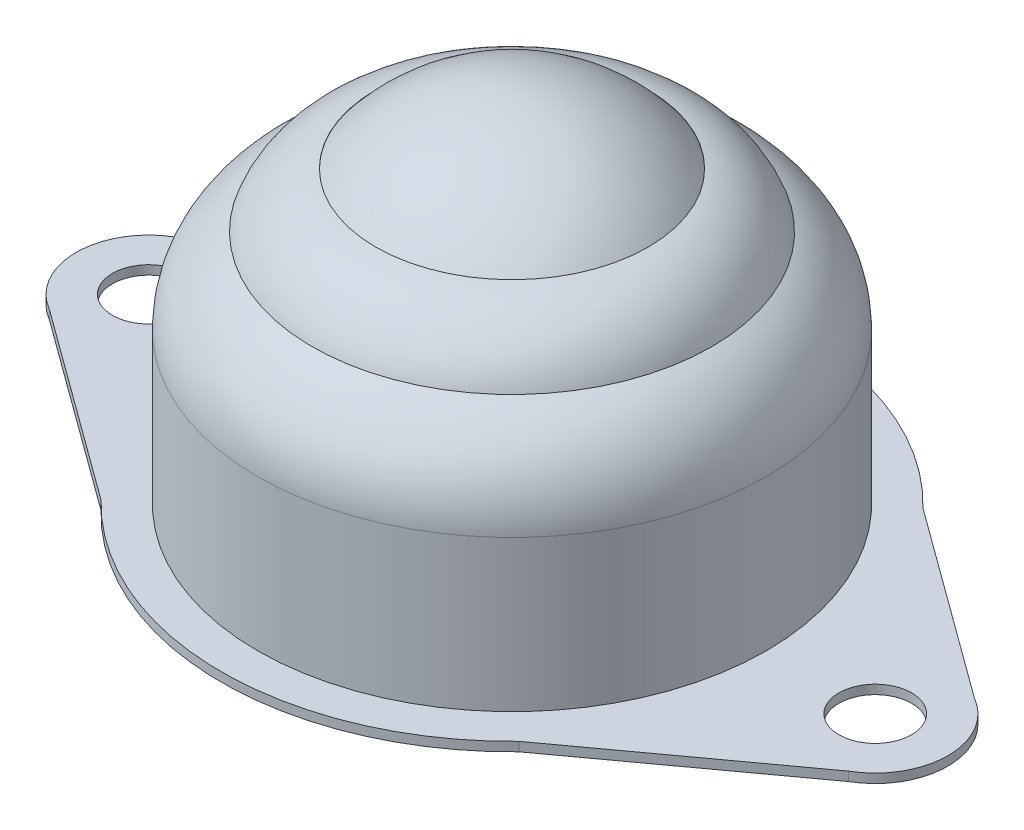
ISO-10303-21;
HEADER;
FILE_DESCRIPTION(('STEP AP214'),'2;1');
FILE_NAME('part.step','',(''),(''),'','','');
FILE_SCHEMA(('AUTOMOTIVE_DESIGN { 1 0 10303 214 1 1 1 1 }'));
ENDSEC;
DATA;
#1=APPLICATION_CONTEXT('core data for automotive mechanical design processes');
#2=APPLICATION_PROTOCOL_DEFINITION('international standard','automotive_design',2000,#1);
#3=PRODUCT_CONTEXT('',#1,'mechanical');
#4=PRODUCT('Part','Part','',(#3));
#5=PRODUCT_RELATED_PRODUCT_CATEGORY('part','',(#4));
#6=PRODUCT_DEFINITION_FORMATION('','',#4);
#7=PRODUCT_DEFINITION_CONTEXT('part definition',#1,'design');
#8=PRODUCT_DEFINITION('design','',#6,#7);
#9=PRODUCT_DEFINITION_SHAPE('','',#8);
#10=(LENGTH_UNIT() NAMED_UNIT(*) SI_UNIT(.MILLI.,.METRE.));
#11=(NAMED_UNIT(*) PLANE_ANGLE_UNIT() SI_UNIT($,.RADIAN.));
#12=(NAMED_UNIT(*) SI_UNIT($,.STERADIAN.) SOLID_ANGLE_UNIT());
#13=UNCERTAINTY_MEASURE_WITH_UNIT(LENGTH_MEASURE(1.E-05),#10,'distance_accuracy_value','');
#14=(GEOMETRIC_REPRESENTATION_CONTEXT(3) GLOBAL_UNCERTAINTY_ASSIGNED_CONTEXT((#13)) GLOBAL_UNIT_ASSIGNED_CONTEXT((#10,
#11,#12)) REPRESENTATION_CONTEXT('',''));
#15=CARTESIAN_POINT('',(0.,0.,0.));
#16=DIRECTION('',(0.,0.,1.));
#17=DIRECTION('',(1.,0.,0.));
#18=AXIS2_PLACEMENT_3D('',#15,#16,#17);
#19=CARTESIAN_POINT('',(0.,9.75,0.));
#20=DIRECTION('',(0.,1.,0.));
#21=DIRECTION('',(1.,0.,0.));
#22=AXIS2_PLACEMENT_3D('',#19,#20,#21);
#23=SPHERICAL_SURFACE('',#22,9.75);
#24=CARTESIAN_POINT('',(0.,19.5,0.));
#25=VERTEX_POINT('',#24);
#26=VERTEX_LOOP('',#25);
#27=FACE_BOUND('',#26,.T.);
#28=ADVANCED_FACE('F42',(#27),#23,.T.);
#29=CLOSED_SHELL('',(#28));
#30=MANIFOLD_SOLID_BREP('B2',#29);
#31=CARTESIAN_POINT('',(0.,8.30667544842264,0.));
#32=DIRECTION('',(0.,-1.,0.));
#33=DIRECTION('',(1.,0.,0.));
#34=AXIS2_PLACEMENT_3D('',#31,#32,#33);
#35=TOROIDAL_SURFACE('',#34,8.82878410892679,5.17121589107318);
#36=CARTESIAN_POINT('',(0.,8.30667544842267,0.));
#37=DIRECTION('',(0.,-1.,0.));
#38=DIRECTION('',(1.,0.,0.));
#39=AXIS2_PLACEMENT_3D('',#36,#37,#38);
#40=CIRCLE('',#39,14.);
#41=CARTESIAN_POINT('',(13.9999999999999,8.30667544842272,0.));
#42=VERTEX_POINT('',#41);
#43=EDGE_CURVE('E182',#42,#42,#40,.T.);
#44=ORIENTED_EDGE('',*,*,#43,.F.);
#45=EDGE_LOOP('',(#44));
#46=FACE_BOUND('',#45,.T.);
#47=CARTESIAN_POINT('',(0.,13.,0.));
#48=DIRECTION('',(0.,-1.,0.));
#49=DIRECTION('',(1.,0.,0.));
#50=AXIS2_PLACEMENT_3D('',#47,#48,#49);
#51=CIRCLE('',#50,10.9999999999999);
#52=CARTESIAN_POINT('',(10.9999999999999,13.0000000000001,0.));
#53=VERTEX_POINT('',#52);
#54=EDGE_CURVE('E40',#53,#53,#51,.T.);
#55=ORIENTED_EDGE('',*,*,#54,.T.);
#56=EDGE_LOOP('',(#55));
#57=FACE_BOUND('',#56,.T.);
#58=ADVANCED_FACE('F54',(#46,#57),#35,.T.);
#59=CARTESIAN_POINT('',(0.,11.5038055215238,0.));
#60=DIRECTION('',(0.,-1.,0.));
#61=DIRECTION('',(1.,0.,0.));
#62=AXIS2_PLACEMENT_3D('',#59,#60,#61);
#63=TOROIDAL_SURFACE('',#62,6.68183330416316,4.57002861374594);
#64=ORIENTED_EDGE('',*,*,#54,.F.);
#65=EDGE_LOOP('',(#64));
#66=FACE_BOUND('',#65,.T.);
#67=CARTESIAN_POINT('',(0.,16.,0.));
#68=DIRECTION('',(0.,-1.,0.));
#69=DIRECTION('',(1.,0.,0.));
#70=AXIS2_PLACEMENT_3D('',#67,#68,#69);
#71=CIRCLE('',#70,7.4999999999999);
#72=CARTESIAN_POINT('',(7.49999999999984,16.,0.));
#73=VERTEX_POINT('',#72);
#74=EDGE_CURVE('E62',#73,#73,#71,.T.);
#75=ORIENTED_EDGE('',*,*,#74,.T.);
#76=EDGE_LOOP('',(#75));
#77=FACE_BOUND('',#76,.T.);
#78=ADVANCED_FACE('F202',(#66,#77),#63,.T.);
#79=CARTESIAN_POINT('',(0.,15.8032312329533,0.));
#80=DIRECTION('',(0.,1.,0.));
#81=DIRECTION('',(-1.,0.,0.));
#82=AXIS2_PLACEMENT_3D('',#79,#80,#81);
#83=CONICAL_SURFACE('',#82,7.46419424187507,0.179999204343552);
#84=ORIENTED_EDGE('',*,*,#74,.F.);
#85=EDGE_LOOP('',(#84));
#86=FACE_BOUND('',#85,.T.);
#87=CARTESIAN_POINT('',(0.,15.8032312329533,0.));
#88=DIRECTION('',(0.,-1.,0.));
#89=DIRECTION('',(1.,0.,0.));
#90=AXIS2_PLACEMENT_3D('',#87,#88,#89);
#91=CIRCLE('',#90,7.46419424187507);
#92=CARTESIAN_POINT('',(7.46419424187501,15.8032312329533,0.));
#93=VERTEX_POINT('',#92);
#94=EDGE_CURVE('E197',#93,#93,#91,.T.);
#95=ORIENTED_EDGE('',*,*,#94,.T.);
#96=EDGE_LOOP('',(#95));
#97=FACE_BOUND('',#96,.T.);
#98=ADVANCED_FACE('F204',(#86,#97),#83,.F.);
#99=CARTESIAN_POINT('',(0.,11.5038055215238,0.));
#100=DIRECTION('',(0.,-1.,0.));
#101=DIRECTION('',(1.,0.,0.));
#102=AXIS2_PLACEMENT_3D('',#99,#100,#101);
#103=TOROIDAL_SURFACE('',#102,6.68183330416316,4.37002861374594);
#104=ORIENTED_EDGE('',*,*,#94,.F.);
#105=EDGE_LOOP('',(#104));
#106=FACE_BOUND('',#105,.T.);
#107=CARTESIAN_POINT('',(0.,12.8537025769554,0.));
#108=DIRECTION('',(0.,-1.,0.));
#109=DIRECTION('',(1.,0.,0.));
#110=AXIS2_PLACEMENT_3D('',#107,#108,#109);
#111=CIRCLE('',#110,10.8381451337418);
#112=CARTESIAN_POINT('',(10.8381451337417,12.8537025769554,0.));
#113=VERTEX_POINT('',#112);
#114=EDGE_CURVE('E194',#113,#113,#111,.T.);
#115=ORIENTED_EDGE('',*,*,#114,.T.);
#116=EDGE_LOOP('',(#115));
#117=FACE_BOUND('',#116,.T.);
#118=ADVANCED_FACE('F207',(#106,#117),#103,.F.);
#119=CARTESIAN_POINT('',(0.,8.30667544842264,0.));
#120=DIRECTION('',(0.,-1.,0.));
#121=DIRECTION('',(1.,0.,0.));
#122=AXIS2_PLACEMENT_3D('',#119,#120,#121);
#123=TOROIDAL_SURFACE('',#122,8.82878410892679,4.97121589107318);
#124=ORIENTED_EDGE('',*,*,#114,.F.);
#125=EDGE_LOOP('',(#124));
#126=FACE_BOUND('',#125,.T.);
#127=CARTESIAN_POINT('',(0.,8.30667544842267,0.));
#128=DIRECTION('',(0.,-1.,0.));
#129=DIRECTION('',(1.,0.,0.));
#130=AXIS2_PLACEMENT_3D('',#127,#128,#129);
#131=CIRCLE('',#130,13.8);
#132=CARTESIAN_POINT('',(13.7999999999999,8.30667544842272,0.));
#133=VERTEX_POINT('',#132);
#134=EDGE_CURVE('E191',#133,#133,#131,.T.);
#135=ORIENTED_EDGE('',*,*,#134,.T.);
#136=EDGE_LOOP('',(#135));
#137=FACE_BOUND('',#136,.T.);
#138=ADVANCED_FACE('F213',(#126,#137),#123,.F.);
#139=CARTESIAN_POINT('',(5.42695743456729E-13,-155.434238590703,0.));
#140=DIRECTION('',(0.,-1.,0.));
#141=DIRECTION('',(1.,0.,0.));
#142=AXIS2_PLACEMENT_3D('',#139,#140,#141);
#143=CYLINDRICAL_SURFACE('',#142,13.8);
#144=ORIENTED_EDGE('',*,*,#134,.F.);
#145=EDGE_LOOP('',(#144));
#146=FACE_BOUND('',#145,.T.);
#147=CARTESIAN_POINT('',(0.,0.200000000000061,0.));
#148=DIRECTION('',(0.,-1.,0.));
#149=DIRECTION('',(1.,0.,0.));
#150=AXIS2_PLACEMENT_3D('',#147,#148,#149);
#151=CIRCLE('',#150,13.8);
#152=CARTESIAN_POINT('',(13.8,0.200000000000109,0.));
#153=VERTEX_POINT('',#152);
#154=EDGE_CURVE('E188',#153,#153,#151,.T.);
#155=ORIENTED_EDGE('',*,*,#154,.T.);
#156=EDGE_LOOP('',(#155));
#157=FACE_BOUND('',#156,.T.);
#158=ADVANCED_FACE('F219',(#146,#157),#143,.F.);
#159=CARTESIAN_POINT('',(-13.8,0.199999999999976,0.));
#160=DIRECTION('',(0.,-1.,0.));
#161=DIRECTION('',(1.,0.,0.));
#162=AXIS2_PLACEMENT_3D('',#159,#160,#161);
#163=PLANE('',#162);
#164=ORIENTED_EDGE('',*,*,#154,.F.);
#165=EDGE_LOOP('',(#164));
#166=FACE_BOUND('',#165,.T.);
#167=ADVANCED_FACE('F225',(#166),#163,.F.);
#168=CARTESIAN_POINT('',(5.42695743456729E-13,-155.434238590703,0.));
#169=DIRECTION('',(0.,-1.,0.));
#170=DIRECTION('',(1.,0.,0.));
#171=AXIS2_PLACEMENT_3D('',#168,#169,#170);
#172=CYLINDRICAL_SURFACE('',#171,14.);
#173=CARTESIAN_POINT('',(0.,0.,0.));
#174=DIRECTION('',(0.,-1.,0.));
#175=DIRECTION('',(1.,0.,0.));
#176=AXIS2_PLACEMENT_3D('',#173,#174,#175);
#177=CIRCLE('',#176,14.);
#178=CARTESIAN_POINT('',(14.,1.04391889975062E-13,0.));
#179=VERTEX_POINT('',#178);
#180=EDGE_CURVE('E185',#179,#179,#177,.T.);
#181=ORIENTED_EDGE('',*,*,#180,.F.);
#182=EDGE_LOOP('',(#181));
#183=FACE_BOUND('',#182,.T.);
#184=ORIENTED_EDGE('',*,*,#43,.T.);
#185=EDGE_LOOP('',(#184));
#186=FACE_BOUND('',#185,.T.);
#187=ADVANCED_FACE('F230',(#183,#186),#172,.T.);
#188=CARTESIAN_POINT('',(0.,-0.5,0.));
#189=DIRECTION('',(0.,-1.,0.));
#190=DIRECTION('',(1.,0.,0.));
#191=AXIS2_PLACEMENT_3D('',#188,#189,#190);
#192=PLANE('',#191);
#193=CARTESIAN_POINT('',(-20.,-0.50000000000007,0.));
#194=DIRECTION('',(0.,-1.,0.));
#195=DIRECTION('',(-1.,0.,0.));
#196=AXIS2_PLACEMENT_3D('',#193,#194,#195);
#197=CIRCLE('',#196,2.);
#198=CARTESIAN_POINT('',(-22.,-0.500000000000077,0.));
#199=VERTEX_POINT('',#198);
#200=EDGE_CURVE('E156',#199,#199,#197,.T.);
#201=ORIENTED_EDGE('',*,*,#200,.F.);
#202=EDGE_LOOP('',(#201));
#203=FACE_BOUND('',#202,.T.);
#204=CARTESIAN_POINT('',(0.,-0.5,0.));
#205=DIRECTION('',(0.,-1.,0.));
#206=DIRECTION('',(1.,0.,0.));
#207=AXIS2_PLACEMENT_3D('',#204,#205,#206);
#208=CIRCLE('',#207,16.);
#209=CARTESIAN_POINT('',(11.4999999999999,-0.49999999999996,11.1242977306435));
#210=VERTEX_POINT('',#209);
#211=CARTESIAN_POINT('',(-11.5,-0.50000000000004,11.1242977306435));
#212=VERTEX_POINT('',#211);
#213=EDGE_CURVE('E167',#210,#212,#208,.T.);
#214=ORIENTED_EDGE('',*,*,#213,.T.);
#215=DIRECTION('',(-0.807862969973212,0.,-0.589370360423784));
#216=VECTOR('',#215,1.);
#217=CARTESIAN_POINT('',(-22.,-0.500000000000077,3.46410161513776));
#218=LINE('',#217,#216);
#219=CARTESIAN_POINT('',(-22.,-0.500000000000077,3.46410161513776));
#220=VERTEX_POINT('',#219);
#221=EDGE_CURVE('E114',#212,#220,#218,.T.);
#222=ORIENTED_EDGE('',*,*,#221,.T.);
#223=CARTESIAN_POINT('',(-20.,-0.50000000000007,0.));
#224=DIRECTION('',(0.,-1.,0.));
#225=DIRECTION('',(-1.,0.,0.));
#226=AXIS2_PLACEMENT_3D('',#223,#224,#225);
#227=CIRCLE('',#226,4.);
#228=CARTESIAN_POINT('',(-22.,-0.500000000000077,-3.46410161513776));
#229=VERTEX_POINT('',#228);
#230=EDGE_CURVE('E410',#220,#229,#227,.T.);
#231=ORIENTED_EDGE('',*,*,#230,.T.);
#232=DIRECTION('',(0.807862969973212,0.,-0.589370360423784));
#233=VECTOR('',#232,1.);
#234=CARTESIAN_POINT('',(-11.5,-0.50000000000004,-11.1242977306435));
#235=LINE('',#234,#233);
#236=CARTESIAN_POINT('',(-11.5,-0.50000000000004,-11.1242977306435));
#237=VERTEX_POINT('',#236);
#238=EDGE_CURVE('E412',#229,#237,#235,.T.);
#239=ORIENTED_EDGE('',*,*,#238,.T.);
#240=CARTESIAN_POINT('',(0.,-0.5,0.));
#241=DIRECTION('',(0.,-1.,0.));
#242=DIRECTION('',(1.,0.,0.));
#243=AXIS2_PLACEMENT_3D('',#240,#241,#242);
#244=CIRCLE('',#243,16.);
#245=CARTESIAN_POINT('',(11.5000000000001,-0.49999999999996,-11.1242977306435));
#246=VERTEX_POINT('',#245);
#247=EDGE_CURVE('E134',#237,#246,#244,.T.);
#248=ORIENTED_EDGE('',*,*,#247,.T.);
#249=DIRECTION('',(0.807862969973203,0.,0.589370360423797));
#250=VECTOR('',#249,1.);
#251=CARTESIAN_POINT('',(11.5000000000001,-0.49999999999996,-11.1242977306435));
#252=LINE('',#251,#250);
#253=CARTESIAN_POINT('',(22.,-0.499999999999923,-3.46410161513753));
#254=VERTEX_POINT('',#253);
#255=EDGE_CURVE('E127',#246,#254,#252,.T.);
#256=ORIENTED_EDGE('',*,*,#255,.T.);
#257=CARTESIAN_POINT('',(20.,-0.49999999999993,0.));
#258=DIRECTION('',(0.,-1.,0.));
#259=DIRECTION('',(1.,0.,0.));
#260=AXIS2_PLACEMENT_3D('',#257,#258,#259);
#261=CIRCLE('',#260,3.9999999999999);
#262=CARTESIAN_POINT('',(21.9999999999999,-0.499999999999923,3.46410161513768));
#263=VERTEX_POINT('',#262);
#264=EDGE_CURVE('E132',#254,#263,#261,.T.);
#265=ORIENTED_EDGE('',*,*,#264,.T.);
#266=DIRECTION('',(-0.807862969973213,0.,0.589370360423782));
#267=VECTOR('',#266,1.);
#268=CARTESIAN_POINT('',(22.,-0.499999999999923,3.46410161513776));
#269=LINE('',#268,#267);
#270=EDGE_CURVE('E70',#263,#210,#269,.T.);
#271=ORIENTED_EDGE('',*,*,#270,.T.);
#272=EDGE_LOOP('',(#214,#222,#231,#239,#248,#256,#265,#271));
#273=FACE_BOUND('',#272,.T.);
#274=CARTESIAN_POINT('',(20.,-0.49999999999993,0.));
#275=DIRECTION('',(0.,-1.,0.));
#276=DIRECTION('',(1.,0.,0.));
#277=AXIS2_PLACEMENT_3D('',#274,#275,#276);
#278=CIRCLE('',#277,2.00000000000001);
#279=CARTESIAN_POINT('',(22.,-0.499999999999923,0.));
#280=VERTEX_POINT('',#279);
#281=EDGE_CURVE('E395',#280,#280,#278,.T.);
#282=ORIENTED_EDGE('',*,*,#281,.F.);
#283=EDGE_LOOP('',(#282));
#284=FACE_BOUND('',#283,.T.);
#285=ADVANCED_FACE('F129',(#203,#273,#284),#192,.T.);
#286=CARTESIAN_POINT('',(0.,0.,0.));
#287=DIRECTION('',(0.,-1.,0.));
#288=DIRECTION('',(1.,0.,0.));
#289=AXIS2_PLACEMENT_3D('',#286,#287,#288);
#290=PLANE('',#289);
#291=ORIENTED_EDGE('',*,*,#180,.T.);
#292=EDGE_LOOP('',(#291));
#293=FACE_BOUND('',#292,.T.);
#294=CARTESIAN_POINT('',(0.,0.,0.));
#295=DIRECTION('',(0.,-1.,0.));
#296=DIRECTION('',(1.,0.,0.));
#297=AXIS2_PLACEMENT_3D('',#294,#295,#296);
#298=CIRCLE('',#297,16.);
#299=CARTESIAN_POINT('',(11.4999999999999,0.,11.1242977306435));
#300=VERTEX_POINT('',#299);
#301=CARTESIAN_POINT('',(-11.5,0.,11.1242977306435));
#302=VERTEX_POINT('',#301);
#303=EDGE_CURVE('E152',#300,#302,#298,.T.);
#304=ORIENTED_EDGE('',*,*,#303,.F.);
#305=DIRECTION('',(-0.807862969973213,0.,0.589370360423782));
#306=VECTOR('',#305,1.);
#307=CARTESIAN_POINT('',(22.,0.,3.46410161513776));
#308=LINE('',#307,#306);
#309=CARTESIAN_POINT('',(21.9999999999999,0.,3.46410161513768));
#310=VERTEX_POINT('',#309);
#311=EDGE_CURVE('E105',#310,#300,#308,.T.);
#312=ORIENTED_EDGE('',*,*,#311,.F.);
#313=CARTESIAN_POINT('',(20.,0.,0.));
#314=DIRECTION('',(0.,-1.,0.));
#315=DIRECTION('',(1.,0.,0.));
#316=AXIS2_PLACEMENT_3D('',#313,#314,#315);
#317=CIRCLE('',#316,3.9999999999999);
#318=CARTESIAN_POINT('',(22.,0.,-3.46410161513753));
#319=VERTEX_POINT('',#318);
#320=EDGE_CURVE('E99',#319,#310,#317,.T.);
#321=ORIENTED_EDGE('',*,*,#320,.F.);
#322=DIRECTION('',(0.807862969973203,0.,0.589370360423797));
#323=VECTOR('',#322,1.);
#324=CARTESIAN_POINT('',(11.5000000000001,0.,-11.1242977306435));
#325=LINE('',#324,#323);
#326=CARTESIAN_POINT('',(11.5000000000001,0.,-11.1242977306435));
#327=VERTEX_POINT('',#326);
#328=EDGE_CURVE('E142',#327,#319,#325,.T.);
#329=ORIENTED_EDGE('',*,*,#328,.F.);
#330=CARTESIAN_POINT('',(0.,0.,0.));
#331=DIRECTION('',(0.,-1.,0.));
#332=DIRECTION('',(1.,0.,0.));
#333=AXIS2_PLACEMENT_3D('',#330,#331,#332);
#334=CIRCLE('',#333,16.);
#335=CARTESIAN_POINT('',(-11.5,0.,-11.1242977306435));
#336=VERTEX_POINT('',#335);
#337=EDGE_CURVE('E162',#336,#327,#334,.T.);
#338=ORIENTED_EDGE('',*,*,#337,.F.);
#339=DIRECTION('',(0.807862969973212,0.,-0.589370360423784));
#340=VECTOR('',#339,1.);
#341=CARTESIAN_POINT('',(-11.5,0.,-11.1242977306435));
#342=LINE('',#341,#340);
#343=CARTESIAN_POINT('',(-22.,0.,-3.46410161513776));
#344=VERTEX_POINT('',#343);
#345=EDGE_CURVE('E160',#344,#336,#342,.T.);
#346=ORIENTED_EDGE('',*,*,#345,.F.);
#347=CARTESIAN_POINT('',(-20.,0.,0.));
#348=DIRECTION('',(0.,-1.,0.));
#349=DIRECTION('',(-1.,0.,0.));
#350=AXIS2_PLACEMENT_3D('',#347,#348,#349);
#351=CIRCLE('',#350,4.);
#352=CARTESIAN_POINT('',(-22.,0.,3.46410161513776));
#353=VERTEX_POINT('',#352);
#354=EDGE_CURVE('E158',#353,#344,#351,.T.);
#355=ORIENTED_EDGE('',*,*,#354,.F.);
#356=DIRECTION('',(-0.807862969973212,0.,-0.589370360423784));
#357=VECTOR('',#356,1.);
#358=CARTESIAN_POINT('',(-22.,0.,3.46410161513776));
#359=LINE('',#358,#357);
#360=EDGE_CURVE('E155',#302,#353,#359,.T.);
#361=ORIENTED_EDGE('',*,*,#360,.F.);
#362=EDGE_LOOP('',(#304,#312,#321,#329,#338,#346,#355,#361));
#363=FACE_BOUND('',#362,.T.);
#364=CARTESIAN_POINT('',(-20.,0.,0.));
#365=DIRECTION('',(0.,-1.,0.));
#366=DIRECTION('',(-1.,0.,0.));
#367=AXIS2_PLACEMENT_3D('',#364,#365,#366);
#368=CIRCLE('',#367,2.);
#369=CARTESIAN_POINT('',(-22.,0.,0.));
#370=VERTEX_POINT('',#369);
#371=EDGE_CURVE('E401',#370,#370,#368,.T.);
#372=ORIENTED_EDGE('',*,*,#371,.T.);
#373=EDGE_LOOP('',(#372));
#374=FACE_BOUND('',#373,.T.);
#375=CARTESIAN_POINT('',(20.,0.,0.));
#376=DIRECTION('',(0.,-1.,0.));
#377=DIRECTION('',(1.,0.,0.));
#378=AXIS2_PLACEMENT_3D('',#375,#376,#377);
#379=CIRCLE('',#378,2.00000000000001);
#380=CARTESIAN_POINT('',(22.,0.,0.));
#381=VERTEX_POINT('',#380);
#382=EDGE_CURVE('E398',#381,#381,#379,.T.);
#383=ORIENTED_EDGE('',*,*,#382,.T.);
#384=EDGE_LOOP('',(#383));
#385=FACE_BOUND('',#384,.T.);
#386=ADVANCED_FACE('F284',(#293,#363,#374,#385),#290,.F.);
#387=CARTESIAN_POINT('',(0.,-0.5,0.));
#388=DIRECTION('',(0.,1.,0.));
#389=DIRECTION('',(-1.,0.,0.));
#390=AXIS2_PLACEMENT_3D('',#387,#388,#389);
#391=CYLINDRICAL_SURFACE('',#390,16.);
#392=ORIENTED_EDGE('',*,*,#303,.T.);
#393=DIRECTION('',(0.,1.,0.));
#394=VECTOR('',#393,1.);
#395=CARTESIAN_POINT('',(-11.5,-0.50000000000004,11.1242977306435));
#396=LINE('',#395,#394);
#397=EDGE_CURVE('E180',#212,#302,#396,.T.);
#398=ORIENTED_EDGE('',*,*,#397,.F.);
#399=ORIENTED_EDGE('',*,*,#213,.F.);
#400=DIRECTION('',(0.,1.,0.));
#401=VECTOR('',#400,1.);
#402=CARTESIAN_POINT('',(11.4999999999999,-0.49999999999996,11.1242977306435));
#403=LINE('',#402,#401);
#404=EDGE_CURVE('E148',#210,#300,#403,.T.);
#405=ORIENTED_EDGE('',*,*,#404,.T.);
#406=EDGE_LOOP('',(#392,#398,#399,#405));
#407=FACE_BOUND('',#406,.T.);
#408=ADVANCED_FACE('F294',(#407),#391,.T.);
#409=CARTESIAN_POINT('',(-22.,-0.500000000000077,3.46410161513776));
#410=DIRECTION('',(0.589370360423784,0.,-0.807862969973212));
#411=DIRECTION('',(-0.807862969973212,0.,-0.589370360423784));
#412=AXIS2_PLACEMENT_3D('',#409,#410,#411);
#413=PLANE('',#412);
#414=ORIENTED_EDGE('',*,*,#360,.T.);
#415=DIRECTION('',(0.,1.,0.));
#416=VECTOR('',#415,1.);
#417=CARTESIAN_POINT('',(-22.,-0.500000000000077,3.46410161513776));
#418=LINE('',#417,#416);
#419=EDGE_CURVE('E177',#220,#353,#418,.T.);
#420=ORIENTED_EDGE('',*,*,#419,.F.);
#421=ORIENTED_EDGE('',*,*,#221,.F.);
#422=ORIENTED_EDGE('',*,*,#397,.T.);
#423=EDGE_LOOP('',(#414,#420,#421,#422));
#424=FACE_BOUND('',#423,.T.);
#425=ADVANCED_FACE('F304',(#424),#413,.F.);
#426=CARTESIAN_POINT('',(-20.,-0.50000000000007,0.));
#427=DIRECTION('',(0.,1.,0.));
#428=DIRECTION('',(-1.,0.,0.));
#429=AXIS2_PLACEMENT_3D('',#426,#427,#428);
#430=CYLINDRICAL_SURFACE('',#429,4.);
#431=ORIENTED_EDGE('',*,*,#354,.T.);
#432=DIRECTION('',(0.,1.,0.));
#433=VECTOR('',#432,1.);
#434=CARTESIAN_POINT('',(-22.,-0.500000000000077,-3.46410161513776));
#435=LINE('',#434,#433);
#436=EDGE_CURVE('E174',#229,#344,#435,.T.);
#437=ORIENTED_EDGE('',*,*,#436,.F.);
#438=ORIENTED_EDGE('',*,*,#230,.F.);
#439=ORIENTED_EDGE('',*,*,#419,.T.);
#440=EDGE_LOOP('',(#431,#437,#438,#439));
#441=FACE_BOUND('',#440,.T.);
#442=ADVANCED_FACE('F314',(#441),#430,.T.);
#443=CARTESIAN_POINT('',(-11.5,-0.50000000000004,-11.1242977306435));
#444=DIRECTION('',(0.589370360423784,0.,0.807862969973212));
#445=DIRECTION('',(0.807862969973212,0.,-0.589370360423784));
#446=AXIS2_PLACEMENT_3D('',#443,#444,#445);
#447=PLANE('',#446);
#448=ORIENTED_EDGE('',*,*,#345,.T.);
#449=DIRECTION('',(0.,1.,0.));
#450=VECTOR('',#449,1.);
#451=CARTESIAN_POINT('',(-11.5,-0.50000000000004,-11.1242977306435));
#452=LINE('',#451,#450);
#453=EDGE_CURVE('E171',#237,#336,#452,.T.);
#454=ORIENTED_EDGE('',*,*,#453,.F.);
#455=ORIENTED_EDGE('',*,*,#238,.F.);
#456=ORIENTED_EDGE('',*,*,#436,.T.);
#457=EDGE_LOOP('',(#448,#454,#455,#456));
#458=FACE_BOUND('',#457,.T.);
#459=ADVANCED_FACE('F323',(#458),#447,.F.);
#460=CARTESIAN_POINT('',(0.,-0.5,0.));
#461=DIRECTION('',(0.,1.,0.));
#462=DIRECTION('',(-1.,0.,0.));
#463=AXIS2_PLACEMENT_3D('',#460,#461,#462);
#464=CYLINDRICAL_SURFACE('',#463,16.);
#465=ORIENTED_EDGE('',*,*,#337,.T.);
#466=DIRECTION('',(0.,1.,0.));
#467=VECTOR('',#466,1.);
#468=CARTESIAN_POINT('',(11.5000000000001,-0.49999999999996,-11.1242977306435));
#469=LINE('',#468,#467);
#470=EDGE_CURVE('E143',#246,#327,#469,.T.);
#471=ORIENTED_EDGE('',*,*,#470,.F.);
#472=ORIENTED_EDGE('',*,*,#247,.F.);
#473=ORIENTED_EDGE('',*,*,#453,.T.);
#474=EDGE_LOOP('',(#465,#471,#472,#473));
#475=FACE_BOUND('',#474,.T.);
#476=ADVANCED_FACE('F333',(#475),#464,.T.);
#477=CARTESIAN_POINT('',(11.5000000000001,-0.49999999999996,-11.1242977306435));
#478=DIRECTION('',(-0.589370360423797,0.,0.807862969973203));
#479=DIRECTION('',(0.807862969973202,0.,0.589370360423797));
#480=AXIS2_PLACEMENT_3D('',#477,#478,#479);
#481=PLANE('',#480);
#482=ORIENTED_EDGE('',*,*,#328,.T.);
#483=DIRECTION('',(0.,1.,0.));
#484=VECTOR('',#483,1.);
#485=CARTESIAN_POINT('',(22.,-0.499999999999923,-3.46410161513753));
#486=LINE('',#485,#484);
#487=EDGE_CURVE('E139',#254,#319,#486,.T.);
#488=ORIENTED_EDGE('',*,*,#487,.F.);
#489=ORIENTED_EDGE('',*,*,#255,.F.);
#490=ORIENTED_EDGE('',*,*,#470,.T.);
#491=EDGE_LOOP('',(#482,#488,#489,#490));
#492=FACE_BOUND('',#491,.T.);
#493=ADVANCED_FACE('F140',(#492),#481,.F.);
#494=CARTESIAN_POINT('',(20.,-0.49999999999993,0.));
#495=DIRECTION('',(0.,1.,0.));
#496=DIRECTION('',(-1.,0.,0.));
#497=AXIS2_PLACEMENT_3D('',#494,#495,#496);
#498=CYLINDRICAL_SURFACE('',#497,3.9999999999999);
#499=ORIENTED_EDGE('',*,*,#320,.T.);
#500=DIRECTION('',(0.,1.,0.));
#501=VECTOR('',#500,1.);
#502=CARTESIAN_POINT('',(21.9999999999999,-0.499999999999923,3.46410161513768));
#503=LINE('',#502,#501);
#504=EDGE_CURVE('E144',#263,#310,#503,.T.);
#505=ORIENTED_EDGE('',*,*,#504,.F.);
#506=ORIENTED_EDGE('',*,*,#264,.F.);
#507=ORIENTED_EDGE('',*,*,#487,.T.);
#508=EDGE_LOOP('',(#499,#505,#506,#507));
#509=FACE_BOUND('',#508,.T.);
#510=ADVANCED_FACE('F146',(#509),#498,.T.);
#511=CARTESIAN_POINT('',(22.,-0.499999999999923,3.46410161513776));
#512=DIRECTION('',(-0.589370360423782,0.,-0.807862969973213));
#513=DIRECTION('',(-0.807862969973213,0.,0.589370360423782));
#514=AXIS2_PLACEMENT_3D('',#511,#512,#513);
#515=PLANE('',#514);
#516=ORIENTED_EDGE('',*,*,#311,.T.);
#517=ORIENTED_EDGE('',*,*,#404,.F.);
#518=ORIENTED_EDGE('',*,*,#270,.F.);
#519=ORIENTED_EDGE('',*,*,#504,.T.);
#520=EDGE_LOOP('',(#516,#517,#518,#519));
#521=FACE_BOUND('',#520,.T.);
#522=ADVANCED_FACE('F360',(#521),#515,.F.);
#523=CARTESIAN_POINT('',(-20.,-0.50000000000007,0.));
#524=DIRECTION('',(0.,1.,0.));
#525=DIRECTION('',(-1.,0.,0.));
#526=AXIS2_PLACEMENT_3D('',#523,#524,#525);
#527=CYLINDRICAL_SURFACE('',#526,2.);
#528=ORIENTED_EDGE('',*,*,#200,.T.);
#529=EDGE_LOOP('',(#528));
#530=FACE_BOUND('',#529,.T.);
#531=ORIENTED_EDGE('',*,*,#371,.F.);
#532=EDGE_LOOP('',(#531));
#533=FACE_BOUND('',#532,.T.);
#534=ADVANCED_FACE('F369',(#530,#533),#527,.F.);
#535=CARTESIAN_POINT('',(20.,-0.49999999999993,0.));
#536=DIRECTION('',(0.,1.,0.));
#537=DIRECTION('',(-1.,0.,0.));
#538=AXIS2_PLACEMENT_3D('',#535,#536,#537);
#539=CYLINDRICAL_SURFACE('',#538,2.00000000000001);
#540=ORIENTED_EDGE('',*,*,#281,.T.);
#541=EDGE_LOOP('',(#540));
#542=FACE_BOUND('',#541,.T.);
#543=ORIENTED_EDGE('',*,*,#382,.F.);
#544=EDGE_LOOP('',(#543));
#545=FACE_BOUND('',#544,.T.);
#546=ADVANCED_FACE('F378',(#542,#545),#539,.F.);
#547=CLOSED_SHELL('',(#58,#78,#98,#118,#138,#158,#167,#187,#285,#386,#408,#425,#442,#459,#476,
#493,#510,#522,#534,#546));
#548=MANIFOLD_SOLID_BREP('B6',#547);
#549=ADVANCED_BREP_SHAPE_REPRESENTATION('',(#18,#30,#548),#14);
#550=SHAPE_DEFINITION_REPRESENTATION(#9,#549);
ENDSEC;
END-ISO-10303-21;
